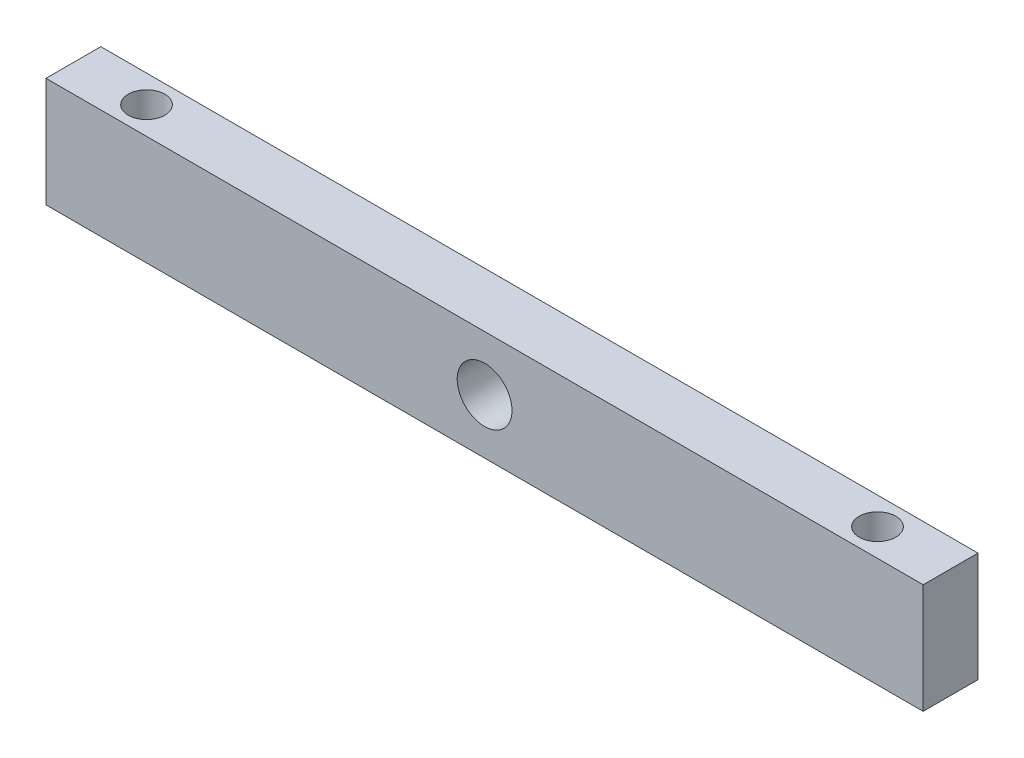
ISO-10303-21;
HEADER;
FILE_DESCRIPTION(('STEP AP214'),'2;1');
FILE_NAME('part.step','',(''),(''),'','','');
FILE_SCHEMA(('AUTOMOTIVE_DESIGN { 1 0 10303 214 1 1 1 1 }'));
ENDSEC;
DATA;
#1=APPLICATION_CONTEXT('core data for automotive mechanical design processes');
#2=APPLICATION_PROTOCOL_DEFINITION('international standard','automotive_design',2000,#1);
#3=PRODUCT_CONTEXT('',#1,'mechanical');
#4=PRODUCT('Part','Part','',(#3));
#5=PRODUCT_RELATED_PRODUCT_CATEGORY('part','',(#4));
#6=PRODUCT_DEFINITION_FORMATION('','',#4);
#7=PRODUCT_DEFINITION_CONTEXT('part definition',#1,'design');
#8=PRODUCT_DEFINITION('design','',#6,#7);
#9=PRODUCT_DEFINITION_SHAPE('','',#8);
#10=(LENGTH_UNIT() NAMED_UNIT(*) SI_UNIT(.MILLI.,.METRE.));
#11=(NAMED_UNIT(*) PLANE_ANGLE_UNIT() SI_UNIT($,.RADIAN.));
#12=(NAMED_UNIT(*) SI_UNIT($,.STERADIAN.) SOLID_ANGLE_UNIT());
#13=UNCERTAINTY_MEASURE_WITH_UNIT(LENGTH_MEASURE(1.E-05),#10,'distance_accuracy_value','');
#14=(GEOMETRIC_REPRESENTATION_CONTEXT(3) GLOBAL_UNCERTAINTY_ASSIGNED_CONTEXT((#13)) GLOBAL_UNIT_ASSIGNED_CONTEXT((#10,
#11,#12)) REPRESENTATION_CONTEXT('',''));
#15=CARTESIAN_POINT('',(0.,0.,0.));
#16=DIRECTION('',(0.,0.,1.));
#17=DIRECTION('',(1.,0.,0.));
#18=AXIS2_PLACEMENT_3D('',#15,#16,#17);
#19=CARTESIAN_POINT('',(-120.,30.,15.));
#20=DIRECTION('',(1.,0.,0.));
#21=DIRECTION('',(0.,0.,-1.));
#22=AXIS2_PLACEMENT_3D('',#19,#20,#21);
#23=PLANE('',#22);
#24=DIRECTION('',(0.,-1.,0.));
#25=VECTOR('',#24,1.);
#26=CARTESIAN_POINT('',(-120.,30.,0.));
#27=LINE('',#26,#25);
#28=CARTESIAN_POINT('',(-120.,30.,0.));
#29=VERTEX_POINT('',#28);
#30=CARTESIAN_POINT('',(-120.,0.,0.));
#31=VERTEX_POINT('',#30);
#32=EDGE_CURVE('E113',#29,#31,#27,.T.);
#33=ORIENTED_EDGE('',*,*,#32,.T.);
#34=DIRECTION('',(0.,0.,-1.));
#35=VECTOR('',#34,1.);
#36=CARTESIAN_POINT('',(-120.,0.,15.));
#37=LINE('',#36,#35);
#38=CARTESIAN_POINT('',(-120.,0.,15.));
#39=VERTEX_POINT('',#38);
#40=EDGE_CURVE('E11',#39,#31,#37,.T.);
#41=ORIENTED_EDGE('',*,*,#40,.F.);
#42=DIRECTION('',(0.,-1.,0.));
#43=VECTOR('',#42,1.);
#44=CARTESIAN_POINT('',(-120.,30.,15.));
#45=LINE('',#44,#43);
#46=CARTESIAN_POINT('',(-120.,30.,15.));
#47=VERTEX_POINT('',#46);
#48=EDGE_CURVE('E94',#47,#39,#45,.T.);
#49=ORIENTED_EDGE('',*,*,#48,.F.);
#50=DIRECTION('',(0.,0.,-1.));
#51=VECTOR('',#50,1.);
#52=CARTESIAN_POINT('',(-120.,30.,15.));
#53=LINE('',#52,#51);
#54=EDGE_CURVE('E109',#47,#29,#53,.T.);
#55=ORIENTED_EDGE('',*,*,#54,.T.);
#56=EDGE_LOOP('',(#33,#41,#49,#55));
#57=FACE_BOUND('',#56,.T.);
#58=ADVANCED_FACE('F41',(#57),#23,.F.);
#59=CARTESIAN_POINT('',(100.,0.,15.));
#60=DIRECTION('',(0.,1.,0.));
#61=DIRECTION('',(0.,0.,1.));
#62=AXIS2_PLACEMENT_3D('',#59,#60,#61);
#63=PLANE('',#62);
#64=CARTESIAN_POINT('',(-100.,0.,7.5));
#65=DIRECTION('',(0.,-1.,0.));
#66=DIRECTION('',(0.,0.,-1.));
#67=AXIS2_PLACEMENT_3D('',#64,#65,#66);
#68=CIRCLE('',#67,4.99999999999999);
#69=CARTESIAN_POINT('',(-100.,0.,2.50000000000001));
#70=VERTEX_POINT('',#69);
#71=EDGE_CURVE('E131',#70,#70,#68,.T.);
#72=ORIENTED_EDGE('',*,*,#71,.F.);
#73=EDGE_LOOP('',(#72));
#74=FACE_BOUND('',#73,.T.);
#75=CARTESIAN_POINT('',(100.,0.,7.5));
#76=DIRECTION('',(0.,-1.,0.));
#77=DIRECTION('',(0.,0.,-1.));
#78=AXIS2_PLACEMENT_3D('',#75,#76,#77);
#79=CIRCLE('',#78,5.);
#80=CARTESIAN_POINT('',(100.,0.,2.5));
#81=VERTEX_POINT('',#80);
#82=EDGE_CURVE('E139',#81,#81,#79,.T.);
#83=ORIENTED_EDGE('',*,*,#82,.F.);
#84=EDGE_LOOP('',(#83));
#85=FACE_BOUND('',#84,.T.);
#86=DIRECTION('',(1.,0.,0.));
#87=VECTOR('',#86,1.);
#88=CARTESIAN_POINT('',(100.,0.,0.));
#89=LINE('',#88,#87);
#90=CARTESIAN_POINT('',(120.,0.,0.));
#91=VERTEX_POINT('',#90);
#92=EDGE_CURVE('E100',#31,#91,#89,.T.);
#93=ORIENTED_EDGE('',*,*,#92,.T.);
#94=DIRECTION('',(0.,0.,-1.));
#95=VECTOR('',#94,1.);
#96=CARTESIAN_POINT('',(120.,0.,15.));
#97=LINE('',#96,#95);
#98=CARTESIAN_POINT('',(120.,0.,15.));
#99=VERTEX_POINT('',#98);
#100=EDGE_CURVE('E51',#99,#91,#97,.T.);
#101=ORIENTED_EDGE('',*,*,#100,.F.);
#102=DIRECTION('',(1.,0.,0.));
#103=VECTOR('',#102,1.);
#104=CARTESIAN_POINT('',(-120.,0.,15.));
#105=LINE('',#104,#103);
#106=EDGE_CURVE('E88',#39,#99,#105,.T.);
#107=ORIENTED_EDGE('',*,*,#106,.F.);
#108=ORIENTED_EDGE('',*,*,#40,.T.);
#109=EDGE_LOOP('',(#93,#101,#107,#108));
#110=FACE_BOUND('',#109,.T.);
#111=ADVANCED_FACE('F99',(#74,#85,#110),#63,.F.);
#112=CARTESIAN_POINT('',(120.,30.,15.));
#113=DIRECTION('',(-1.,0.,0.));
#114=DIRECTION('',(0.,0.,1.));
#115=AXIS2_PLACEMENT_3D('',#112,#113,#114);
#116=PLANE('',#115);
#117=DIRECTION('',(0.,1.,0.));
#118=VECTOR('',#117,1.);
#119=CARTESIAN_POINT('',(120.,30.,0.));
#120=LINE('',#119,#118);
#121=CARTESIAN_POINT('',(120.,30.,0.));
#122=VERTEX_POINT('',#121);
#123=EDGE_CURVE('E120',#91,#122,#120,.T.);
#124=ORIENTED_EDGE('',*,*,#123,.T.);
#125=DIRECTION('',(0.,0.,-1.));
#126=VECTOR('',#125,1.);
#127=CARTESIAN_POINT('',(120.,30.,15.));
#128=LINE('',#127,#126);
#129=CARTESIAN_POINT('',(120.,30.,15.));
#130=VERTEX_POINT('',#129);
#131=EDGE_CURVE('E103',#130,#122,#128,.T.);
#132=ORIENTED_EDGE('',*,*,#131,.F.);
#133=DIRECTION('',(0.,1.,0.));
#134=VECTOR('',#133,1.);
#135=CARTESIAN_POINT('',(120.,30.,15.));
#136=LINE('',#135,#134);
#137=EDGE_CURVE('E91',#99,#130,#136,.T.);
#138=ORIENTED_EDGE('',*,*,#137,.F.);
#139=ORIENTED_EDGE('',*,*,#100,.T.);
#140=EDGE_LOOP('',(#124,#132,#138,#139));
#141=FACE_BOUND('',#140,.T.);
#142=ADVANCED_FACE('F105',(#141),#116,.F.);
#143=CARTESIAN_POINT('',(-100.,30.,15.));
#144=DIRECTION('',(0.,-1.,0.));
#145=DIRECTION('',(0.,0.,-1.));
#146=AXIS2_PLACEMENT_3D('',#143,#144,#145);
#147=PLANE('',#146);
#148=CARTESIAN_POINT('',(-100.,30.,7.5));
#149=DIRECTION('',(0.,-1.,0.));
#150=DIRECTION('',(0.,0.,-1.));
#151=AXIS2_PLACEMENT_3D('',#148,#149,#150);
#152=CIRCLE('',#151,4.99999999999999);
#153=CARTESIAN_POINT('',(-100.,30.,2.50000000000001));
#154=VERTEX_POINT('',#153);
#155=EDGE_CURVE('E44',#154,#154,#152,.T.);
#156=ORIENTED_EDGE('',*,*,#155,.T.);
#157=EDGE_LOOP('',(#156));
#158=FACE_BOUND('',#157,.T.);
#159=CARTESIAN_POINT('',(100.,30.,7.5));
#160=DIRECTION('',(0.,-1.,0.));
#161=DIRECTION('',(0.,0.,-1.));
#162=AXIS2_PLACEMENT_3D('',#159,#160,#161);
#163=CIRCLE('',#162,5.);
#164=CARTESIAN_POINT('',(100.,30.,2.5));
#165=VERTEX_POINT('',#164);
#166=EDGE_CURVE('E128',#165,#165,#163,.T.);
#167=ORIENTED_EDGE('',*,*,#166,.T.);
#168=EDGE_LOOP('',(#167));
#169=FACE_BOUND('',#168,.T.);
#170=DIRECTION('',(-1.,0.,0.));
#171=VECTOR('',#170,1.);
#172=CARTESIAN_POINT('',(-100.,30.,0.));
#173=LINE('',#172,#171);
#174=EDGE_CURVE('E77',#122,#29,#173,.T.);
#175=ORIENTED_EDGE('',*,*,#174,.T.);
#176=ORIENTED_EDGE('',*,*,#54,.F.);
#177=DIRECTION('',(-1.,0.,0.));
#178=VECTOR('',#177,1.);
#179=CARTESIAN_POINT('',(100.,30.,15.));
#180=LINE('',#179,#178);
#181=EDGE_CURVE('E60',#130,#47,#180,.T.);
#182=ORIENTED_EDGE('',*,*,#181,.F.);
#183=ORIENTED_EDGE('',*,*,#131,.T.);
#184=EDGE_LOOP('',(#175,#176,#182,#183));
#185=FACE_BOUND('',#184,.T.);
#186=ADVANCED_FACE('F159',(#158,#169,#185),#147,.F.);
#187=CARTESIAN_POINT('',(0.,0.,15.));
#188=DIRECTION('',(0.,0.,1.));
#189=DIRECTION('',(1.,0.,0.));
#190=AXIS2_PLACEMENT_3D('',#187,#188,#189);
#191=PLANE('',#190);
#192=CARTESIAN_POINT('',(0.,15.,15.));
#193=DIRECTION('',(0.,0.,1.));
#194=DIRECTION('',(1.,0.,0.));
#195=AXIS2_PLACEMENT_3D('',#192,#193,#194);
#196=CIRCLE('',#195,7.5);
#197=CARTESIAN_POINT('',(7.50000000000001,15.,15.));
#198=VERTEX_POINT('',#197);
#199=EDGE_CURVE('E137',#198,#198,#196,.T.);
#200=ORIENTED_EDGE('',*,*,#199,.F.);
#201=EDGE_LOOP('',(#200));
#202=FACE_BOUND('',#201,.T.);
#203=ORIENTED_EDGE('',*,*,#48,.T.);
#204=ORIENTED_EDGE('',*,*,#106,.T.);
#205=ORIENTED_EDGE('',*,*,#137,.T.);
#206=ORIENTED_EDGE('',*,*,#181,.T.);
#207=EDGE_LOOP('',(#203,#204,#205,#206));
#208=FACE_BOUND('',#207,.T.);
#209=ADVANCED_FACE('F89',(#202,#208),#191,.T.);
#210=CARTESIAN_POINT('',(0.,0.,0.));
#211=DIRECTION('',(0.,0.,1.));
#212=DIRECTION('',(1.,0.,0.));
#213=AXIS2_PLACEMENT_3D('',#210,#211,#212);
#214=PLANE('',#213);
#215=CARTESIAN_POINT('',(0.,15.,0.));
#216=DIRECTION('',(0.,0.,1.));
#217=DIRECTION('',(1.,0.,0.));
#218=AXIS2_PLACEMENT_3D('',#215,#216,#217);
#219=CIRCLE('',#218,7.5);
#220=CARTESIAN_POINT('',(7.50000000000001,15.,0.));
#221=VERTEX_POINT('',#220);
#222=EDGE_CURVE('E117',#221,#221,#219,.T.);
#223=ORIENTED_EDGE('',*,*,#222,.T.);
#224=EDGE_LOOP('',(#223));
#225=FACE_BOUND('',#224,.T.);
#226=ORIENTED_EDGE('',*,*,#32,.F.);
#227=ORIENTED_EDGE('',*,*,#174,.F.);
#228=ORIENTED_EDGE('',*,*,#123,.F.);
#229=ORIENTED_EDGE('',*,*,#92,.F.);
#230=EDGE_LOOP('',(#226,#227,#228,#229));
#231=FACE_BOUND('',#230,.T.);
#232=ADVANCED_FACE('F158',(#225,#231),#214,.F.);
#233=CARTESIAN_POINT('',(0.,15.,0.));
#234=DIRECTION('',(0.,0.,1.));
#235=DIRECTION('',(1.,0.,0.));
#236=AXIS2_PLACEMENT_3D('',#233,#234,#235);
#237=CYLINDRICAL_SURFACE('',#236,7.5);
#238=ORIENTED_EDGE('',*,*,#222,.F.);
#239=EDGE_LOOP('',(#238));
#240=FACE_BOUND('',#239,.T.);
#241=ORIENTED_EDGE('',*,*,#199,.T.);
#242=EDGE_LOOP('',(#241));
#243=FACE_BOUND('',#242,.T.);
#244=ADVANCED_FACE('F155',(#240,#243),#237,.F.);
#245=CARTESIAN_POINT('',(100.,79.,7.5));
#246=DIRECTION('',(0.,-1.,0.));
#247=DIRECTION('',(0.,0.,-1.));
#248=AXIS2_PLACEMENT_3D('',#245,#246,#247);
#249=CYLINDRICAL_SURFACE('',#248,5.);
#250=ORIENTED_EDGE('',*,*,#82,.T.);
#251=EDGE_LOOP('',(#250));
#252=FACE_BOUND('',#251,.T.);
#253=ORIENTED_EDGE('',*,*,#166,.F.);
#254=EDGE_LOOP('',(#253));
#255=FACE_BOUND('',#254,.T.);
#256=ADVANCED_FACE('F183',(#252,#255),#249,.F.);
#257=CARTESIAN_POINT('',(-100.,79.,7.5));
#258=DIRECTION('',(0.,-1.,0.));
#259=DIRECTION('',(0.,0.,-1.));
#260=AXIS2_PLACEMENT_3D('',#257,#258,#259);
#261=CYLINDRICAL_SURFACE('',#260,4.99999999999999);
#262=ORIENTED_EDGE('',*,*,#71,.T.);
#263=EDGE_LOOP('',(#262));
#264=FACE_BOUND('',#263,.T.);
#265=ORIENTED_EDGE('',*,*,#155,.F.);
#266=EDGE_LOOP('',(#265));
#267=FACE_BOUND('',#266,.T.);
#268=ADVANCED_FACE('F186',(#264,#267),#261,.F.);
#269=CLOSED_SHELL('',(#58,#111,#142,#186,#209,#232,#244,#256,#268));
#270=MANIFOLD_SOLID_BREP('B2',#269);
#271=ADVANCED_BREP_SHAPE_REPRESENTATION('',(#18,#270),#14);
#272=SHAPE_DEFINITION_REPRESENTATION(#9,#271);
ENDSEC;
END-ISO-10303-21;
